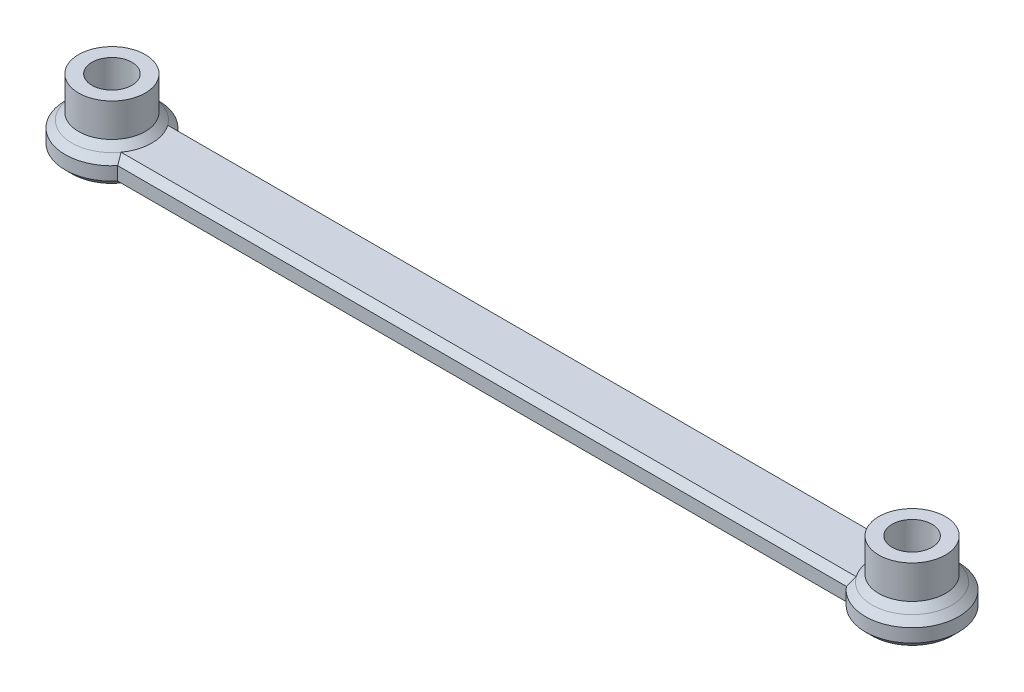
ISO-10303-21;
HEADER;
FILE_DESCRIPTION(('STEP AP214'),'2;1');
FILE_NAME('part.step','',(''),(''),'','','');
FILE_SCHEMA(('AUTOMOTIVE_DESIGN { 1 0 10303 214 1 1 1 1 }'));
ENDSEC;
DATA;
#1=APPLICATION_CONTEXT('core data for automotive mechanical design processes');
#2=APPLICATION_PROTOCOL_DEFINITION('international standard','automotive_design',2000,#1);
#3=PRODUCT_CONTEXT('',#1,'mechanical');
#4=PRODUCT('Part','Part','',(#3));
#5=PRODUCT_RELATED_PRODUCT_CATEGORY('part','',(#4));
#6=PRODUCT_DEFINITION_FORMATION('','',#4);
#7=PRODUCT_DEFINITION_CONTEXT('part definition',#1,'design');
#8=PRODUCT_DEFINITION('design','',#6,#7);
#9=PRODUCT_DEFINITION_SHAPE('','',#8);
#10=(LENGTH_UNIT() NAMED_UNIT(*) SI_UNIT(.MILLI.,.METRE.));
#11=(NAMED_UNIT(*) PLANE_ANGLE_UNIT() SI_UNIT($,.RADIAN.));
#12=(NAMED_UNIT(*) SI_UNIT($,.STERADIAN.) SOLID_ANGLE_UNIT());
#13=UNCERTAINTY_MEASURE_WITH_UNIT(LENGTH_MEASURE(1.E-05),#10,'distance_accuracy_value','');
#14=(GEOMETRIC_REPRESENTATION_CONTEXT(3) GLOBAL_UNCERTAINTY_ASSIGNED_CONTEXT((#13)) GLOBAL_UNIT_ASSIGNED_CONTEXT((#10,
#11,#12)) REPRESENTATION_CONTEXT('',''));
#15=CARTESIAN_POINT('',(0.,0.,0.));
#16=DIRECTION('',(0.,0.,1.));
#17=DIRECTION('',(1.,0.,0.));
#18=AXIS2_PLACEMENT_3D('',#15,#16,#17);
#19=CARTESIAN_POINT('',(60.,4.,0.));
#20=DIRECTION('',(0.,-1.,0.));
#21=DIRECTION('',(0.,0.,-1.));
#22=AXIS2_PLACEMENT_3D('',#19,#20,#21);
#23=CYLINDRICAL_SURFACE('',#22,7.);
#24=DIRECTION('',(0.,-1.,0.));
#25=VECTOR('',#24,1.);
#26=CARTESIAN_POINT('',(54.6380973526182,4.,4.49999999999999));
#27=LINE('',#26,#25);
#28=CARTESIAN_POINT('',(54.6380973526182,3.00000000000001,4.49999999999999));
#29=VERTEX_POINT('',#28);
#30=CARTESIAN_POINT('',(54.6380973526182,1.00000000000001,4.49999999999999));
#31=VERTEX_POINT('',#30);
#32=EDGE_CURVE('E108',#29,#31,#27,.T.);
#33=ORIENTED_EDGE('',*,*,#32,.T.);
#34=CARTESIAN_POINT('',(60.,1.00000000000001,0.));
#35=DIRECTION('',(0.,1.,0.));
#36=DIRECTION('',(0.,0.,1.));
#37=AXIS2_PLACEMENT_3D('',#34,#35,#36);
#38=CIRCLE('',#37,7.);
#39=CARTESIAN_POINT('',(54.6380973526182,1.00000000000001,-4.50000000000001));
#40=VERTEX_POINT('',#39);
#41=EDGE_CURVE('E114',#31,#40,#38,.T.);
#42=ORIENTED_EDGE('',*,*,#41,.T.);
#43=DIRECTION('',(0.,-1.,0.));
#44=VECTOR('',#43,1.);
#45=CARTESIAN_POINT('',(54.6380973526182,4.,-4.50000000000001));
#46=LINE('',#45,#44);
#47=CARTESIAN_POINT('',(54.6380973526182,3.00000000000001,-4.50000000000001));
#48=VERTEX_POINT('',#47);
#49=EDGE_CURVE('E260',#48,#40,#46,.T.);
#50=ORIENTED_EDGE('',*,*,#49,.F.);
#51=CARTESIAN_POINT('',(60.,3.00000000000001,0.));
#52=DIRECTION('',(0.,1.,0.));
#53=DIRECTION('',(0.,0.,1.));
#54=AXIS2_PLACEMENT_3D('',#51,#52,#53);
#55=CIRCLE('',#54,7.);
#56=EDGE_CURVE('E236',#48,#29,#55,.F.);
#57=ORIENTED_EDGE('',*,*,#56,.T.);
#58=EDGE_LOOP('',(#33,#42,#50,#57));
#59=FACE_BOUND('',#58,.T.);
#60=ADVANCED_FACE('F32',(#59),#23,.T.);
#61=CARTESIAN_POINT('',(0.,4.,-4.5));
#62=DIRECTION('',(0.,0.,1.));
#63=DIRECTION('',(1.,0.,0.));
#64=AXIS2_PLACEMENT_3D('',#61,#62,#63);
#65=PLANE('',#64);
#66=ORIENTED_EDGE('',*,*,#49,.T.);
#67=DIRECTION('',(-1.,0.,0.));
#68=VECTOR('',#67,1.);
#69=CARTESIAN_POINT('',(0.,1.00000000000001,-4.5));
#70=LINE('',#69,#68);
#71=CARTESIAN_POINT('',(-54.6380973526182,1.00000000000001,-4.49999999999999));
#72=VERTEX_POINT('',#71);
#73=EDGE_CURVE('E238',#40,#72,#70,.T.);
#74=ORIENTED_EDGE('',*,*,#73,.T.);
#75=DIRECTION('',(0.,-1.,0.));
#76=VECTOR('',#75,1.);
#77=CARTESIAN_POINT('',(-54.6380973526182,4.,-4.49999999999999));
#78=LINE('',#77,#76);
#79=CARTESIAN_POINT('',(-54.6380973526182,3.00000000000001,-4.49999999999999));
#80=VERTEX_POINT('',#79);
#81=EDGE_CURVE('E125',#80,#72,#78,.T.);
#82=ORIENTED_EDGE('',*,*,#81,.F.);
#83=DIRECTION('',(1.,0.,0.));
#84=VECTOR('',#83,1.);
#85=CARTESIAN_POINT('',(54.6380973526182,3.00000000000001,-4.50000000000001));
#86=LINE('',#85,#84);
#87=EDGE_CURVE('E240',#80,#48,#86,.T.);
#88=ORIENTED_EDGE('',*,*,#87,.T.);
#89=EDGE_LOOP('',(#66,#74,#82,#88));
#90=FACE_BOUND('',#89,.T.);
#91=ADVANCED_FACE('F194',(#90),#65,.F.);
#92=CARTESIAN_POINT('',(-60.,4.,0.));
#93=DIRECTION('',(0.,-1.,0.));
#94=DIRECTION('',(0.,0.,-1.));
#95=AXIS2_PLACEMENT_3D('',#92,#93,#94);
#96=CYLINDRICAL_SURFACE('',#95,7.);
#97=ORIENTED_EDGE('',*,*,#81,.T.);
#98=CARTESIAN_POINT('',(-60.,1.00000000000001,0.));
#99=DIRECTION('',(0.,1.,0.));
#100=DIRECTION('',(0.,0.,1.));
#101=AXIS2_PLACEMENT_3D('',#98,#99,#100);
#102=CIRCLE('',#101,7.);
#103=CARTESIAN_POINT('',(-54.6380973526182,1.00000000000001,4.50000000000001));
#104=VERTEX_POINT('',#103);
#105=EDGE_CURVE('E124',#72,#104,#102,.T.);
#106=ORIENTED_EDGE('',*,*,#105,.T.);
#107=DIRECTION('',(0.,-1.,0.));
#108=VECTOR('',#107,1.);
#109=CARTESIAN_POINT('',(-54.6380973526182,4.,4.50000000000001));
#110=LINE('',#109,#108);
#111=CARTESIAN_POINT('',(-54.6380973526182,3.00000000000001,4.50000000000001));
#112=VERTEX_POINT('',#111);
#113=EDGE_CURVE('E106',#112,#104,#110,.T.);
#114=ORIENTED_EDGE('',*,*,#113,.F.);
#115=CARTESIAN_POINT('',(-60.,3.00000000000001,0.));
#116=DIRECTION('',(0.,1.,0.));
#117=DIRECTION('',(0.,0.,1.));
#118=AXIS2_PLACEMENT_3D('',#115,#116,#117);
#119=CIRCLE('',#118,7.);
#120=EDGE_CURVE('E121',#112,#80,#119,.F.);
#121=ORIENTED_EDGE('',*,*,#120,.T.);
#122=EDGE_LOOP('',(#97,#106,#114,#121));
#123=FACE_BOUND('',#122,.T.);
#124=ADVANCED_FACE('F120',(#123),#96,.T.);
#125=CARTESIAN_POINT('',(0.,4.,4.5));
#126=DIRECTION('',(0.,0.,1.));
#127=DIRECTION('',(1.,0.,0.));
#128=AXIS2_PLACEMENT_3D('',#125,#126,#127);
#129=PLANE('',#128);
#130=ORIENTED_EDGE('',*,*,#113,.T.);
#131=DIRECTION('',(1.,0.,0.));
#132=VECTOR('',#131,1.);
#133=CARTESIAN_POINT('',(54.6380973526182,1.00000000000001,4.49999999999999));
#134=LINE('',#133,#132);
#135=EDGE_CURVE('E113',#104,#31,#134,.T.);
#136=ORIENTED_EDGE('',*,*,#135,.T.);
#137=ORIENTED_EDGE('',*,*,#32,.F.);
#138=DIRECTION('',(-1.,0.,0.));
#139=VECTOR('',#138,1.);
#140=CARTESIAN_POINT('',(0.,3.00000000000001,4.5));
#141=LINE('',#140,#139);
#142=EDGE_CURVE('E103',#29,#112,#141,.T.);
#143=ORIENTED_EDGE('',*,*,#142,.T.);
#144=EDGE_LOOP('',(#130,#136,#137,#143));
#145=FACE_BOUND('',#144,.T.);
#146=ADVANCED_FACE('F105',(#145),#129,.T.);
#147=CARTESIAN_POINT('',(0.,4.,0.));
#148=DIRECTION('',(0.,1.,0.));
#149=DIRECTION('',(0.,0.,1.));
#150=AXIS2_PLACEMENT_3D('',#147,#148,#149);
#151=PLANE('',#150);
#152=CARTESIAN_POINT('',(60.,4.,0.));
#153=DIRECTION('',(0.,1.,0.));
#154=DIRECTION('',(0.,0.,1.));
#155=AXIS2_PLACEMENT_3D('',#152,#153,#154);
#156=CIRCLE('',#155,5.99999999999999);
#157=CARTESIAN_POINT('',(55.1266028275955,4.,3.49999999999999));
#158=VERTEX_POINT('',#157);
#159=CARTESIAN_POINT('',(55.1266028275955,4.,-3.5));
#160=VERTEX_POINT('',#159);
#161=EDGE_CURVE('E252',#158,#160,#156,.F.);
#162=ORIENTED_EDGE('',*,*,#161,.T.);
#163=DIRECTION('',(-1.,0.,0.));
#164=VECTOR('',#163,1.);
#165=CARTESIAN_POINT('',(-54.6380973526182,4.,-3.49999999999999));
#166=LINE('',#165,#164);
#167=CARTESIAN_POINT('',(-55.1266028275955,4.,-3.5));
#168=VERTEX_POINT('',#167);
#169=EDGE_CURVE('E11',#160,#168,#166,.T.);
#170=ORIENTED_EDGE('',*,*,#169,.T.);
#171=CARTESIAN_POINT('',(-60.,4.,0.));
#172=DIRECTION('',(0.,1.,0.));
#173=DIRECTION('',(0.,0.,1.));
#174=AXIS2_PLACEMENT_3D('',#171,#172,#173);
#175=CIRCLE('',#174,5.99999999999999);
#176=CARTESIAN_POINT('',(-55.1266028275955,4.,3.50000000000001));
#177=VERTEX_POINT('',#176);
#178=EDGE_CURVE('E255',#168,#177,#175,.F.);
#179=ORIENTED_EDGE('',*,*,#178,.T.);
#180=DIRECTION('',(1.,0.,0.));
#181=VECTOR('',#180,1.);
#182=CARTESIAN_POINT('',(0.,4.,3.5));
#183=LINE('',#182,#181);
#184=EDGE_CURVE('E45',#177,#158,#183,.T.);
#185=ORIENTED_EDGE('',*,*,#184,.T.);
#186=EDGE_LOOP('',(#162,#170,#179,#185));
#187=FACE_BOUND('',#186,.T.);
#188=ADVANCED_FACE('F299',(#187),#151,.T.);
#189=CARTESIAN_POINT('',(0.,0.,0.));
#190=DIRECTION('',(0.,1.,0.));
#191=DIRECTION('',(0.,0.,1.));
#192=AXIS2_PLACEMENT_3D('',#189,#190,#191);
#193=PLANE('',#192);
#194=DIRECTION('',(-1.,0.,0.));
#195=VECTOR('',#194,1.);
#196=CARTESIAN_POINT('',(-54.6380973526182,0.,3.49999999999999));
#197=LINE('',#196,#195);
#198=CARTESIAN_POINT('',(55.1266028275955,0.,3.49999999999998));
#199=VERTEX_POINT('',#198);
#200=CARTESIAN_POINT('',(-55.1266028275955,0.,3.49999999999999));
#201=VERTEX_POINT('',#200);
#202=EDGE_CURVE('E247',#199,#201,#197,.T.);
#203=ORIENTED_EDGE('',*,*,#202,.T.);
#204=CARTESIAN_POINT('',(-60.,0.,0.));
#205=DIRECTION('',(0.,1.,0.));
#206=DIRECTION('',(0.,0.,1.));
#207=AXIS2_PLACEMENT_3D('',#204,#205,#206);
#208=CIRCLE('',#207,5.99999999999998);
#209=CARTESIAN_POINT('',(-55.1266028275955,0.,-3.49999999999998));
#210=VERTEX_POINT('',#209);
#211=EDGE_CURVE('E229',#201,#210,#208,.F.);
#212=ORIENTED_EDGE('',*,*,#211,.T.);
#213=DIRECTION('',(1.,0.,0.));
#214=VECTOR('',#213,1.);
#215=CARTESIAN_POINT('',(0.,0.,-3.49999999999998));
#216=LINE('',#215,#214);
#217=CARTESIAN_POINT('',(55.1266028275955,0.,-3.49999999999999));
#218=VERTEX_POINT('',#217);
#219=EDGE_CURVE('E243',#210,#218,#216,.T.);
#220=ORIENTED_EDGE('',*,*,#219,.T.);
#221=CARTESIAN_POINT('',(60.,0.,0.));
#222=DIRECTION('',(0.,1.,0.));
#223=DIRECTION('',(0.,0.,1.));
#224=AXIS2_PLACEMENT_3D('',#221,#222,#223);
#225=CIRCLE('',#224,5.99999999999998);
#226=EDGE_CURVE('E245',#218,#199,#225,.F.);
#227=ORIENTED_EDGE('',*,*,#226,.T.);
#228=EDGE_LOOP('',(#203,#212,#220,#227));
#229=FACE_BOUND('',#228,.T.);
#230=CARTESIAN_POINT('',(-60.,0.,0.));
#231=DIRECTION('',(0.,1.,0.));
#232=DIRECTION('',(0.,0.,1.));
#233=AXIS2_PLACEMENT_3D('',#230,#231,#232);
#234=CIRCLE('',#233,3.);
#235=CARTESIAN_POINT('',(-60.,0.,3.00000000000001));
#236=VERTEX_POINT('',#235);
#237=EDGE_CURVE('E266',#236,#236,#234,.T.);
#238=ORIENTED_EDGE('',*,*,#237,.T.);
#239=EDGE_LOOP('',(#238));
#240=FACE_BOUND('',#239,.T.);
#241=CARTESIAN_POINT('',(60.,0.,0.));
#242=DIRECTION('',(0.,1.,0.));
#243=DIRECTION('',(0.,0.,1.));
#244=AXIS2_PLACEMENT_3D('',#241,#242,#243);
#245=CIRCLE('',#244,3.);
#246=CARTESIAN_POINT('',(60.,0.,3.00000000000001));
#247=VERTEX_POINT('',#246);
#248=EDGE_CURVE('E169',#247,#247,#245,.F.);
#249=ORIENTED_EDGE('',*,*,#248,.F.);
#250=EDGE_LOOP('',(#249));
#251=FACE_BOUND('',#250,.T.);
#252=ADVANCED_FACE('F296',(#229,#240,#251),#193,.F.);
#253=CARTESIAN_POINT('',(-60.,10.,0.));
#254=DIRECTION('',(0.,-1.,0.));
#255=DIRECTION('',(0.,0.,-1.));
#256=AXIS2_PLACEMENT_3D('',#253,#254,#255);
#257=CYLINDRICAL_SURFACE('',#256,3.);
#258=CARTESIAN_POINT('',(-60.,10.,0.));
#259=DIRECTION('',(0.,1.,0.));
#260=DIRECTION('',(0.,0.,1.));
#261=AXIS2_PLACEMENT_3D('',#258,#259,#260);
#262=CIRCLE('',#261,3.);
#263=CARTESIAN_POINT('',(-60.,10.,3.00000000000001));
#264=VERTEX_POINT('',#263);
#265=EDGE_CURVE('E269',#264,#264,#262,.T.);
#266=ORIENTED_EDGE('',*,*,#265,.T.);
#267=EDGE_LOOP('',(#266));
#268=FACE_BOUND('',#267,.T.);
#269=ORIENTED_EDGE('',*,*,#237,.F.);
#270=EDGE_LOOP('',(#269));
#271=FACE_BOUND('',#270,.T.);
#272=ADVANCED_FACE('F298',(#268,#271),#257,.F.);
#273=CARTESIAN_POINT('',(-60.,10.,0.));
#274=DIRECTION('',(0.,-1.,0.));
#275=DIRECTION('',(0.,0.,-1.));
#276=AXIS2_PLACEMENT_3D('',#273,#274,#275);
#277=CYLINDRICAL_SURFACE('',#276,5.);
#278=CARTESIAN_POINT('',(-60.,4.99999999999999,0.));
#279=DIRECTION('',(0.,1.,0.));
#280=DIRECTION('',(0.,0.,1.));
#281=AXIS2_PLACEMENT_3D('',#278,#279,#280);
#282=CIRCLE('',#281,5.);
#283=CARTESIAN_POINT('',(-60.,4.99999999999999,5.00000000000001));
#284=VERTEX_POINT('',#283);
#285=EDGE_CURVE('E134',#284,#284,#282,.T.);
#286=ORIENTED_EDGE('',*,*,#285,.T.);
#287=EDGE_LOOP('',(#286));
#288=FACE_BOUND('',#287,.T.);
#289=CARTESIAN_POINT('',(-60.,10.,0.));
#290=DIRECTION('',(0.,1.,0.));
#291=DIRECTION('',(0.,0.,1.));
#292=AXIS2_PLACEMENT_3D('',#289,#290,#291);
#293=CIRCLE('',#292,5.);
#294=CARTESIAN_POINT('',(-60.,10.,5.00000000000001));
#295=VERTEX_POINT('',#294);
#296=EDGE_CURVE('E265',#295,#295,#293,.T.);
#297=ORIENTED_EDGE('',*,*,#296,.F.);
#298=EDGE_LOOP('',(#297));
#299=FACE_BOUND('',#298,.T.);
#300=ADVANCED_FACE('F306',(#288,#299),#277,.T.);
#301=CARTESIAN_POINT('',(0.,10.,0.));
#302=DIRECTION('',(0.,1.,0.));
#303=DIRECTION('',(0.,0.,1.));
#304=AXIS2_PLACEMENT_3D('',#301,#302,#303);
#305=PLANE('',#304);
#306=ORIENTED_EDGE('',*,*,#265,.F.);
#307=EDGE_LOOP('',(#306));
#308=FACE_BOUND('',#307,.T.);
#309=ORIENTED_EDGE('',*,*,#296,.T.);
#310=EDGE_LOOP('',(#309));
#311=FACE_BOUND('',#310,.T.);
#312=ADVANCED_FACE('F413',(#308,#311),#305,.T.);
#313=CARTESIAN_POINT('',(60.,10.,0.));
#314=DIRECTION('',(0.,-1.,0.));
#315=DIRECTION('',(0.,0.,-1.));
#316=AXIS2_PLACEMENT_3D('',#313,#314,#315);
#317=CYLINDRICAL_SURFACE('',#316,5.);
#318=CARTESIAN_POINT('',(60.,4.99999999999999,0.));
#319=DIRECTION('',(0.,1.,0.));
#320=DIRECTION('',(0.,0.,1.));
#321=AXIS2_PLACEMENT_3D('',#318,#319,#320);
#322=CIRCLE('',#321,5.);
#323=CARTESIAN_POINT('',(60.,4.99999999999999,5.00000000000001));
#324=VERTEX_POINT('',#323);
#325=EDGE_CURVE('E257',#324,#324,#322,.T.);
#326=ORIENTED_EDGE('',*,*,#325,.T.);
#327=EDGE_LOOP('',(#326));
#328=FACE_BOUND('',#327,.T.);
#329=CARTESIAN_POINT('',(60.,10.,0.));
#330=DIRECTION('',(0.,1.,0.));
#331=DIRECTION('',(0.,0.,1.));
#332=AXIS2_PLACEMENT_3D('',#329,#330,#331);
#333=CIRCLE('',#332,5.);
#334=CARTESIAN_POINT('',(60.,10.,5.00000000000001));
#335=VERTEX_POINT('',#334);
#336=EDGE_CURVE('E277',#335,#335,#333,.F.);
#337=ORIENTED_EDGE('',*,*,#336,.T.);
#338=EDGE_LOOP('',(#337));
#339=FACE_BOUND('',#338,.T.);
#340=ADVANCED_FACE('F283',(#328,#339),#317,.T.);
#341=CARTESIAN_POINT('',(60.,10.,0.));
#342=DIRECTION('',(0.,-1.,0.));
#343=DIRECTION('',(0.,0.,-1.));
#344=AXIS2_PLACEMENT_3D('',#341,#342,#343);
#345=CYLINDRICAL_SURFACE('',#344,3.);
#346=CARTESIAN_POINT('',(60.,10.,0.));
#347=DIRECTION('',(0.,1.,0.));
#348=DIRECTION('',(0.,0.,1.));
#349=AXIS2_PLACEMENT_3D('',#346,#347,#348);
#350=CIRCLE('',#349,3.);
#351=CARTESIAN_POINT('',(60.,10.,3.00000000000001));
#352=VERTEX_POINT('',#351);
#353=EDGE_CURVE('E270',#352,#352,#350,.F.);
#354=ORIENTED_EDGE('',*,*,#353,.F.);
#355=EDGE_LOOP('',(#354));
#356=FACE_BOUND('',#355,.T.);
#357=ORIENTED_EDGE('',*,*,#248,.T.);
#358=EDGE_LOOP('',(#357));
#359=FACE_BOUND('',#358,.T.);
#360=ADVANCED_FACE('F287',(#356,#359),#345,.F.);
#361=CARTESIAN_POINT('',(0.,10.,0.));
#362=DIRECTION('',(0.,1.,0.));
#363=DIRECTION('',(0.,0.,1.));
#364=AXIS2_PLACEMENT_3D('',#361,#362,#363);
#365=PLANE('',#364);
#366=ORIENTED_EDGE('',*,*,#336,.F.);
#367=EDGE_LOOP('',(#366));
#368=FACE_BOUND('',#367,.T.);
#369=ORIENTED_EDGE('',*,*,#353,.T.);
#370=EDGE_LOOP('',(#369));
#371=FACE_BOUND('',#370,.T.);
#372=ADVANCED_FACE('F205',(#368,#371),#365,.T.);
#373=CARTESIAN_POINT('',(60.,4.99999999999999,0.));
#374=DIRECTION('',(0.,-1.,0.));
#375=DIRECTION('',(0.,0.,-1.));
#376=AXIS2_PLACEMENT_3D('',#373,#374,#375);
#377=CONICAL_SURFACE('',#376,5.,0.785398163397447);
#378=ORIENTED_EDGE('',*,*,#161,.F.);
#379=EDGE_CURVE('E254',#160,#158,#156,.F.);
#380=ORIENTED_EDGE('',*,*,#379,.F.);
#381=EDGE_LOOP('',(#378,#380));
#382=FACE_BOUND('',#381,.T.);
#383=ORIENTED_EDGE('',*,*,#325,.F.);
#384=EDGE_LOOP('',(#383));
#385=FACE_BOUND('',#384,.T.);
#386=ADVANCED_FACE('F190',(#382,#385),#377,.T.);
#387=CARTESIAN_POINT('',(-60.,4.99999999999999,0.));
#388=DIRECTION('',(0.,-1.,0.));
#389=DIRECTION('',(0.,0.,-1.));
#390=AXIS2_PLACEMENT_3D('',#387,#388,#389);
#391=CONICAL_SURFACE('',#390,5.,0.785398163397447);
#392=ORIENTED_EDGE('',*,*,#178,.F.);
#393=EDGE_CURVE('E52',#177,#168,#175,.F.);
#394=ORIENTED_EDGE('',*,*,#393,.F.);
#395=EDGE_LOOP('',(#392,#394));
#396=FACE_BOUND('',#395,.T.);
#397=ORIENTED_EDGE('',*,*,#285,.F.);
#398=EDGE_LOOP('',(#397));
#399=FACE_BOUND('',#398,.T.);
#400=ADVANCED_FACE('F181',(#396,#399),#391,.T.);
#401=CARTESIAN_POINT('',(60.,0.,0.));
#402=DIRECTION('',(0.,1.,0.));
#403=DIRECTION('',(0.,0.,1.));
#404=AXIS2_PLACEMENT_3D('',#401,#402,#403);
#405=CONICAL_SURFACE('',#404,5.99999999999998,0.785398163397451);
#406=CARTESIAN_POINT('',(55.1266028275955,0.,3.49999999999998));
#407=CARTESIAN_POINT('',(55.084084045195,0.0828868400841924,3.58288684008417));
#408=CARTESIAN_POINT('',(55.0420549480796,0.165898875067519,3.6658988750675));
#409=CARTESIAN_POINT('',(54.9589211335512,0.332149055119084,3.83214905511906));
#410=CARTESIAN_POINT('',(54.9178163661373,0.415387187682454,3.91538718768243));
#411=CARTESIAN_POINT('',(54.836472031137,0.582073436939071,4.08207343693905));
#412=CARTESIAN_POINT('',(54.796232454839,0.665521551508541,4.16552155150852));
#413=CARTESIAN_POINT('',(54.7165666275548,0.832616755389028,4.33261675538901));
#414=CARTESIAN_POINT('',(54.6771404207805,0.916263855241968,4.41626385524195));
#415=CARTESIAN_POINT('',(54.6380973526182,1.00000000000002,4.49999999999999));
#416=B_SPLINE_CURVE_WITH_KNOTS('',3,(#406,#407,#408,#409,#410,#411,#412,#413,#414,#415),
.UNSPECIFIED.,.F.,.F.,(4,2,2,2,4),(0.,0.374076648679749,0.748133013111139,1.12218560938836,
1.49625848449581),.UNSPECIFIED.);
#417=EDGE_CURVE('E170',#199,#31,#416,.T.);
#418=ORIENTED_EDGE('',*,*,#417,.F.);
#419=ORIENTED_EDGE('',*,*,#226,.F.);
#420=CARTESIAN_POINT('',(55.1266028275955,0.,-3.49999999999999));
#421=CARTESIAN_POINT('',(55.084084045195,0.0828868400841929,-3.58288684008418));
#422=CARTESIAN_POINT('',(55.0420549480797,0.165898875067519,-3.66589887506751));
#423=CARTESIAN_POINT('',(54.9589211335512,0.332149055119083,-3.83214905511907));
#424=CARTESIAN_POINT('',(54.9178163661373,0.415387187682453,-3.91538718768244));
#425=CARTESIAN_POINT('',(54.836472031137,0.582073436939068,-4.08207343693906));
#426=CARTESIAN_POINT('',(54.796232454839,0.665521551508536,-4.16552155150853));
#427=CARTESIAN_POINT('',(54.7165666275549,0.832616755389024,-4.33261675538901));
#428=CARTESIAN_POINT('',(54.6771404207805,0.916263855241964,-4.41626385524195));
#429=CARTESIAN_POINT('',(54.6380973526182,1.00000000000001,-4.5));
#430=B_SPLINE_CURVE_WITH_KNOTS('',3,(#420,#421,#422,#423,#424,#425,#426,#427,#428,#429),
.UNSPECIFIED.,.F.,.F.,(4,2,2,2,4),(0.,0.374076648679749,0.748133013111136,1.12218560938836,
1.49625848449581),.UNSPECIFIED.);
#431=EDGE_CURVE('E162',#40,#218,#430,.F.);
#432=ORIENTED_EDGE('',*,*,#431,.F.);
#433=ORIENTED_EDGE('',*,*,#41,.F.);
#434=EDGE_LOOP('',(#418,#419,#432,#433));
#435=FACE_BOUND('',#434,.T.);
#436=ADVANCED_FACE('F178',(#435),#405,.T.);
#437=CARTESIAN_POINT('',(0.,1.00000000000001,-4.5));
#438=DIRECTION('',(0.,0.707106781186547,0.707106781186547));
#439=DIRECTION('',(-1.,0.,0.));
#440=AXIS2_PLACEMENT_3D('',#437,#438,#439);
#441=PLANE('',#440);
#442=ORIENTED_EDGE('',*,*,#431,.T.);
#443=ORIENTED_EDGE('',*,*,#219,.F.);
#444=CARTESIAN_POINT('',(-55.1266028275955,0.,-3.49999999999998));
#445=CARTESIAN_POINT('',(-55.084084045195,0.0828868400841925,-3.58288684008417));
#446=CARTESIAN_POINT('',(-55.0420549480796,0.165898875067519,-3.6658988750675));
#447=CARTESIAN_POINT('',(-54.9589211335512,0.332149055119083,-3.83214905511906));
#448=CARTESIAN_POINT('',(-54.9178163661373,0.415387187682454,-3.91538718768243));
#449=CARTESIAN_POINT('',(-54.836472031137,0.58207343693907,-4.08207343693905));
#450=CARTESIAN_POINT('',(-54.796232454839,0.665521551508538,-4.16552155150852));
#451=CARTESIAN_POINT('',(-54.7165666275549,0.832616755389025,-4.332616755389));
#452=CARTESIAN_POINT('',(-54.6771404207805,0.916263855241965,-4.41626385524194));
#453=CARTESIAN_POINT('',(-54.6380973526182,1.00000000000001,-4.49999999999999));
#454=B_SPLINE_CURVE_WITH_KNOTS('',3,(#444,#445,#446,#447,#448,#449,#450,#451,#452,#453),
.UNSPECIFIED.,.F.,.F.,(4,2,2,2,4),(0.,0.374076648679747,0.748133013111137,1.12218560938836,
1.49625848449581),.UNSPECIFIED.);
#455=EDGE_CURVE('E218',#72,#210,#454,.F.);
#456=ORIENTED_EDGE('',*,*,#455,.F.);
#457=ORIENTED_EDGE('',*,*,#73,.F.);
#458=EDGE_LOOP('',(#442,#443,#456,#457));
#459=FACE_BOUND('',#458,.T.);
#460=ADVANCED_FACE('F176',(#459),#441,.F.);
#461=CARTESIAN_POINT('',(0.,0.,3.49999999999998));
#462=DIRECTION('',(0.,-0.707106781186547,0.707106781186547));
#463=DIRECTION('',(1.,0.,0.));
#464=AXIS2_PLACEMENT_3D('',#461,#462,#463);
#465=PLANE('',#464);
#466=ORIENTED_EDGE('',*,*,#417,.T.);
#467=ORIENTED_EDGE('',*,*,#135,.F.);
#468=CARTESIAN_POINT('',(-54.6380973526182,1.00000000000001,4.50000000000001));
#469=CARTESIAN_POINT('',(-54.6771404207805,0.916263855241966,4.41626385524196));
#470=CARTESIAN_POINT('',(-54.7165666275548,0.832616755389027,4.33261675538902));
#471=CARTESIAN_POINT('',(-54.796232454839,0.665521551508539,4.16552155150853));
#472=CARTESIAN_POINT('',(-54.836472031137,0.58207343693907,4.08207343693906));
#473=CARTESIAN_POINT('',(-54.9178163661373,0.415387187682453,3.91538718768244));
#474=CARTESIAN_POINT('',(-54.9589211335512,0.332149055119081,3.83214905511907));
#475=CARTESIAN_POINT('',(-55.0420549480796,0.165898875067516,3.66589887506751));
#476=CARTESIAN_POINT('',(-55.084084045195,0.0828868400841899,3.58288684008418));
#477=CARTESIAN_POINT('',(-55.1266028275955,0.,3.49999999999999));
#478=B_SPLINE_CURVE_WITH_KNOTS('',3,(#468,#469,#470,#471,#472,#473,#474,#475,#476,#477),
.UNSPECIFIED.,.F.,.F.,(4,2,2,2,4),(0.,0.374072875107447,0.748125471384676,1.12218183581607,
1.49625848449581),.UNSPECIFIED.);
#479=EDGE_CURVE('E138',#201,#104,#478,.F.);
#480=ORIENTED_EDGE('',*,*,#479,.F.);
#481=ORIENTED_EDGE('',*,*,#202,.F.);
#482=EDGE_LOOP('',(#466,#467,#480,#481));
#483=FACE_BOUND('',#482,.T.);
#484=ADVANCED_FACE('F188',(#483),#465,.T.);
#485=CARTESIAN_POINT('',(-60.,1.00000000000001,0.));
#486=DIRECTION('',(0.,1.,0.));
#487=DIRECTION('',(0.,0.,1.));
#488=AXIS2_PLACEMENT_3D('',#485,#486,#487);
#489=CONICAL_SURFACE('',#488,7.,0.785398163397451);
#490=ORIENTED_EDGE('',*,*,#455,.T.);
#491=ORIENTED_EDGE('',*,*,#211,.F.);
#492=ORIENTED_EDGE('',*,*,#479,.T.);
#493=ORIENTED_EDGE('',*,*,#105,.F.);
#494=EDGE_LOOP('',(#490,#491,#492,#493));
#495=FACE_BOUND('',#494,.T.);
#496=ADVANCED_FACE('F208',(#495),#489,.T.);
#497=CARTESIAN_POINT('',(-60.,4.,0.));
#498=DIRECTION('',(0.,-1.,0.));
#499=DIRECTION('',(0.,0.,-1.));
#500=AXIS2_PLACEMENT_3D('',#497,#498,#499);
#501=CONICAL_SURFACE('',#500,5.99999999999999,0.785398163397458);
#502=CARTESIAN_POINT('',(-55.1266028275955,4.,3.5));
#503=CARTESIAN_POINT('',(-55.084084045195,3.91711315991581,3.5828868400842));
#504=CARTESIAN_POINT('',(-55.0420549480796,3.83410112493249,3.66589887506752));
#505=CARTESIAN_POINT('',(-54.9589211335512,3.66785094488093,3.83214905511908));
#506=CARTESIAN_POINT('',(-54.9178163661373,3.58461281231756,3.91538718768245));
#507=CARTESIAN_POINT('',(-54.836472031137,3.41792656306095,4.08207343693907));
#508=CARTESIAN_POINT('',(-54.796232454839,3.33447844849148,4.16552155150853));
#509=CARTESIAN_POINT('',(-54.7165666275549,3.167383244611,4.33261675538902));
#510=CARTESIAN_POINT('',(-54.6771404207805,3.08373614475806,4.41626385524196));
#511=CARTESIAN_POINT('',(-54.6380973526182,3.00000000000001,4.5));
#512=B_SPLINE_CURVE_WITH_KNOTS('',3,(#502,#503,#504,#505,#506,#507,#508,#509,#510,#511),
.UNSPECIFIED.,.F.,.F.,(4,2,2,2,4),(0.,0.37407664867974,0.74813301311112,1.12218560938834,
1.49625848449578),.UNSPECIFIED.);
#513=EDGE_CURVE('E130',#177,#112,#512,.T.);
#514=ORIENTED_EDGE('',*,*,#513,.F.);
#515=ORIENTED_EDGE('',*,*,#393,.T.);
#516=CARTESIAN_POINT('',(-55.1266028275955,4.,-3.49999999999999));
#517=CARTESIAN_POINT('',(-55.084084045195,3.91711315991581,-3.58288684008418));
#518=CARTESIAN_POINT('',(-55.0420549480796,3.83410112493249,-3.66589887506751));
#519=CARTESIAN_POINT('',(-54.9589211335512,3.66785094488093,-3.83214905511907));
#520=CARTESIAN_POINT('',(-54.9178163661373,3.58461281231756,-3.91538718768244));
#521=CARTESIAN_POINT('',(-54.836472031137,3.41792656306095,-4.08207343693905));
#522=CARTESIAN_POINT('',(-54.796232454839,3.33447844849148,-4.16552155150852));
#523=CARTESIAN_POINT('',(-54.7165666275549,3.167383244611,-4.33261675538901));
#524=CARTESIAN_POINT('',(-54.6771404207805,3.08373614475806,-4.41626385524194));
#525=CARTESIAN_POINT('',(-54.6380973526182,3.00000000000001,-4.49999999999999));
#526=B_SPLINE_CURVE_WITH_KNOTS('',3,(#516,#517,#518,#519,#520,#521,#522,#523,#524,#525),
.UNSPECIFIED.,.F.,.F.,(4,2,2,2,4),(0.,0.374076648679743,0.748133013111122,1.12218560938834,
1.49625848449578),.UNSPECIFIED.);
#527=EDGE_CURVE('E37',#80,#168,#526,.F.);
#528=ORIENTED_EDGE('',*,*,#527,.F.);
#529=ORIENTED_EDGE('',*,*,#120,.F.);
#530=EDGE_LOOP('',(#514,#515,#528,#529));
#531=FACE_BOUND('',#530,.T.);
#532=ADVANCED_FACE('F34',(#531),#501,.T.);
#533=CARTESIAN_POINT('',(0.,4.,-3.5));
#534=DIRECTION('',(0.,0.707106781186552,-0.707106781186543));
#535=DIRECTION('',(1.,0.,0.));
#536=AXIS2_PLACEMENT_3D('',#533,#534,#535);
#537=PLANE('',#536);
#538=ORIENTED_EDGE('',*,*,#527,.T.);
#539=ORIENTED_EDGE('',*,*,#169,.F.);
#540=CARTESIAN_POINT('',(55.1266028275955,4.,-3.5));
#541=CARTESIAN_POINT('',(55.084084045195,3.91711315991581,-3.5828868400842));
#542=CARTESIAN_POINT('',(55.0420549480796,3.83410112493249,-3.66589887506752));
#543=CARTESIAN_POINT('',(54.9589211335512,3.66785094488093,-3.83214905511908));
#544=CARTESIAN_POINT('',(54.9178163661373,3.58461281231756,-3.91538718768245));
#545=CARTESIAN_POINT('',(54.836472031137,3.41792656306094,-4.08207343693907));
#546=CARTESIAN_POINT('',(54.796232454839,3.33447844849148,-4.16552155150853));
#547=CARTESIAN_POINT('',(54.7165666275549,3.167383244611,-4.33261675538902));
#548=CARTESIAN_POINT('',(54.6771404207805,3.08373614475806,-4.41626385524196));
#549=CARTESIAN_POINT('',(54.6380973526182,3.00000000000001,-4.50000000000001));
#550=B_SPLINE_CURVE_WITH_KNOTS('',3,(#540,#541,#542,#543,#544,#545,#546,#547,#548,#549),
.UNSPECIFIED.,.F.,.F.,(4,2,2,2,4),(0.,0.37407664867974,0.74813301311112,1.12218560938834,
1.49625848449578),.UNSPECIFIED.);
#551=EDGE_CURVE('E137',#48,#160,#550,.F.);
#552=ORIENTED_EDGE('',*,*,#551,.F.);
#553=ORIENTED_EDGE('',*,*,#87,.F.);
#554=EDGE_LOOP('',(#538,#539,#552,#553));
#555=FACE_BOUND('',#554,.T.);
#556=ADVANCED_FACE('F153',(#555),#537,.T.);
#557=CARTESIAN_POINT('',(0.,3.00000000000001,4.5));
#558=DIRECTION('',(0.,-0.707106781186552,-0.707106781186543));
#559=DIRECTION('',(-1.,0.,0.));
#560=AXIS2_PLACEMENT_3D('',#557,#558,#559);
#561=PLANE('',#560);
#562=ORIENTED_EDGE('',*,*,#513,.T.);
#563=ORIENTED_EDGE('',*,*,#142,.F.);
#564=CARTESIAN_POINT('',(54.6380973526182,3.00000000000001,4.49999999999999));
#565=CARTESIAN_POINT('',(54.6771404207805,3.08373614475806,4.41626385524195));
#566=CARTESIAN_POINT('',(54.7165666275548,3.167383244611,4.33261675538901));
#567=CARTESIAN_POINT('',(54.796232454839,3.33447844849148,4.16552155150852));
#568=CARTESIAN_POINT('',(54.836472031137,3.41792656306094,4.08207343693906));
#569=CARTESIAN_POINT('',(54.9178163661373,3.58461281231756,3.91538718768244));
#570=CARTESIAN_POINT('',(54.9589211335512,3.66785094488093,3.83214905511907));
#571=CARTESIAN_POINT('',(55.0420549480796,3.83410112493249,3.66589887506751));
#572=CARTESIAN_POINT('',(55.0840840451949,3.91711315991581,3.58288684008418));
#573=CARTESIAN_POINT('',(55.1266028275955,4.,3.49999999999999));
#574=B_SPLINE_CURVE_WITH_KNOTS('',3,(#564,#565,#566,#567,#568,#569,#570,#571,#572,#573),
.UNSPECIFIED.,.F.,.F.,(4,2,2,2,4),(0.,0.374072875107439,0.74812547138466,1.12218183581604,
1.49625848449578),.UNSPECIFIED.);
#575=EDGE_CURVE('E139',#158,#29,#574,.F.);
#576=ORIENTED_EDGE('',*,*,#575,.F.);
#577=ORIENTED_EDGE('',*,*,#184,.F.);
#578=EDGE_LOOP('',(#562,#563,#576,#577));
#579=FACE_BOUND('',#578,.T.);
#580=ADVANCED_FACE('F136',(#579),#561,.F.);
#581=CARTESIAN_POINT('',(60.,3.00000000000001,0.));
#582=DIRECTION('',(0.,-1.,0.));
#583=DIRECTION('',(0.,0.,-1.));
#584=AXIS2_PLACEMENT_3D('',#581,#582,#583);
#585=CONICAL_SURFACE('',#584,7.,0.785398163397458);
#586=ORIENTED_EDGE('',*,*,#551,.T.);
#587=ORIENTED_EDGE('',*,*,#379,.T.);
#588=ORIENTED_EDGE('',*,*,#575,.T.);
#589=ORIENTED_EDGE('',*,*,#56,.F.);
#590=EDGE_LOOP('',(#586,#587,#588,#589));
#591=FACE_BOUND('',#590,.T.);
#592=ADVANCED_FACE('F152',(#591),#585,.T.);
#593=CLOSED_SHELL('',(#60,#91,#124,#146,#188,#252,#272,#300,#312,#340,#360,#372,#386,#400,#436,
#460,#484,#496,#532,#556,#580,#592));
#594=MANIFOLD_SOLID_BREP('B2',#593);
#595=ADVANCED_BREP_SHAPE_REPRESENTATION('',(#18,#594),#14);
#596=SHAPE_DEFINITION_REPRESENTATION(#9,#595);
ENDSEC;
END-ISO-10303-21;
